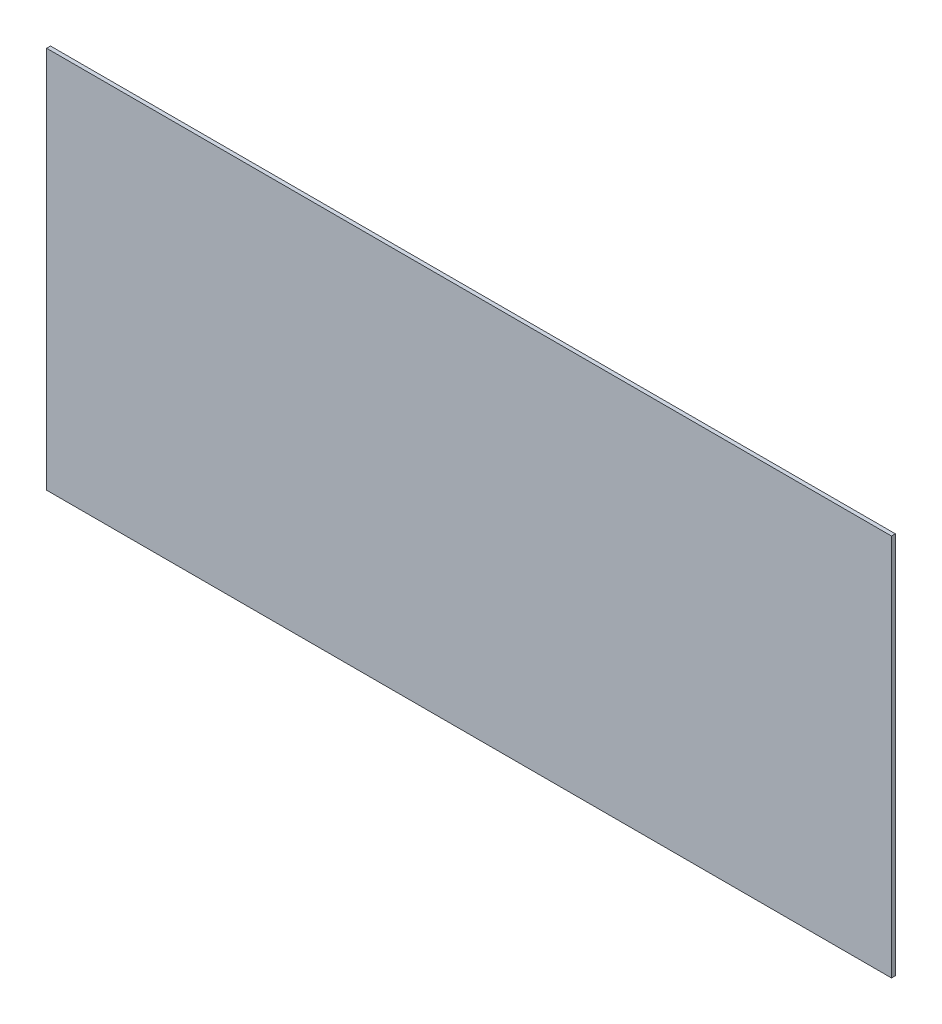
ISO-10303-21;
HEADER;
FILE_DESCRIPTION(('STEP AP214'),'2;1');
FILE_NAME('part.step','',(''),(''),'','','');
FILE_SCHEMA(('AUTOMOTIVE_DESIGN { 1 0 10303 214 1 1 1 1 }'));
ENDSEC;
DATA;
#1=APPLICATION_CONTEXT('core data for automotive mechanical design processes');
#2=APPLICATION_PROTOCOL_DEFINITION('international standard','automotive_design',2000,#1);
#3=PRODUCT_CONTEXT('',#1,'mechanical');
#4=PRODUCT('Part','Part','',(#3));
#5=PRODUCT_RELATED_PRODUCT_CATEGORY('part','',(#4));
#6=PRODUCT_DEFINITION_FORMATION('','',#4);
#7=PRODUCT_DEFINITION_CONTEXT('part definition',#1,'design');
#8=PRODUCT_DEFINITION('design','',#6,#7);
#9=PRODUCT_DEFINITION_SHAPE('','',#8);
#10=(LENGTH_UNIT() NAMED_UNIT(*) SI_UNIT(.MILLI.,.METRE.));
#11=(NAMED_UNIT(*) PLANE_ANGLE_UNIT() SI_UNIT($,.RADIAN.));
#12=(NAMED_UNIT(*) SI_UNIT($,.STERADIAN.) SOLID_ANGLE_UNIT());
#13=UNCERTAINTY_MEASURE_WITH_UNIT(LENGTH_MEASURE(1.E-05),#10,'distance_accuracy_value','');
#14=(GEOMETRIC_REPRESENTATION_CONTEXT(3) GLOBAL_UNCERTAINTY_ASSIGNED_CONTEXT((#13)) GLOBAL_UNIT_ASSIGNED_CONTEXT((#10,
#11,#12)) REPRESENTATION_CONTEXT('',''));
#15=CARTESIAN_POINT('',(0.,0.,0.));
#16=DIRECTION('',(0.,0.,1.));
#17=DIRECTION('',(1.,0.,0.));
#18=AXIS2_PLACEMENT_3D('',#15,#16,#17);
#19=CARTESIAN_POINT('',(0.,0.,1.5875));
#20=DIRECTION('',(1.,0.,0.));
#21=DIRECTION('',(0.,0.,-1.));
#22=AXIS2_PLACEMENT_3D('',#19,#20,#21);
#23=PLANE('',#22);
#24=DIRECTION('',(0.,-1.,0.));
#25=VECTOR('',#24,1.);
#26=CARTESIAN_POINT('',(0.,0.,0.));
#27=LINE('',#26,#25);
#28=CARTESIAN_POINT('',(0.,156.55,0.));
#29=VERTEX_POINT('',#28);
#30=CARTESIAN_POINT('',(0.,0.,0.));
#31=VERTEX_POINT('',#30);
#32=EDGE_CURVE('E111',#29,#31,#27,.T.);
#33=ORIENTED_EDGE('',*,*,#32,.T.);
#34=DIRECTION('',(0.,0.,-1.));
#35=VECTOR('',#34,1.);
#36=CARTESIAN_POINT('',(0.,0.,1.5875));
#37=LINE('',#36,#35);
#38=CARTESIAN_POINT('',(0.,0.,1.5875));
#39=VERTEX_POINT('',#38);
#40=EDGE_CURVE('E11',#39,#31,#37,.T.);
#41=ORIENTED_EDGE('',*,*,#40,.F.);
#42=DIRECTION('',(0.,-1.,0.));
#43=VECTOR('',#42,1.);
#44=CARTESIAN_POINT('',(0.,0.,1.5875));
#45=LINE('',#44,#43);
#46=CARTESIAN_POINT('',(0.,156.55,1.5875));
#47=VERTEX_POINT('',#46);
#48=EDGE_CURVE('E95',#47,#39,#45,.T.);
#49=ORIENTED_EDGE('',*,*,#48,.F.);
#50=DIRECTION('',(0.,0.,-1.));
#51=VECTOR('',#50,1.);
#52=CARTESIAN_POINT('',(0.,156.55,1.5875));
#53=LINE('',#52,#51);
#54=EDGE_CURVE('E107',#47,#29,#53,.T.);
#55=ORIENTED_EDGE('',*,*,#54,.T.);
#56=EDGE_LOOP('',(#33,#41,#49,#55));
#57=FACE_BOUND('',#56,.T.);
#58=ADVANCED_FACE('F43',(#57),#23,.F.);
#59=CARTESIAN_POINT('',(0.,0.,1.5875));
#60=DIRECTION('',(0.,1.,0.));
#61=DIRECTION('',(0.,0.,1.));
#62=AXIS2_PLACEMENT_3D('',#59,#60,#61);
#63=PLANE('',#62);
#64=DIRECTION('',(1.,0.,0.));
#65=VECTOR('',#64,1.);
#66=CARTESIAN_POINT('',(0.,0.,0.));
#67=LINE('',#66,#65);
#68=CARTESIAN_POINT('',(345.57,0.,0.));
#69=VERTEX_POINT('',#68);
#70=EDGE_CURVE('E100',#31,#69,#67,.T.);
#71=ORIENTED_EDGE('',*,*,#70,.T.);
#72=DIRECTION('',(0.,0.,-1.));
#73=VECTOR('',#72,1.);
#74=CARTESIAN_POINT('',(345.57,0.,1.5875));
#75=LINE('',#74,#73);
#76=CARTESIAN_POINT('',(345.57,0.,1.5875));
#77=VERTEX_POINT('',#76);
#78=EDGE_CURVE('E52',#77,#69,#75,.T.);
#79=ORIENTED_EDGE('',*,*,#78,.F.);
#80=DIRECTION('',(1.,0.,0.));
#81=VECTOR('',#80,1.);
#82=CARTESIAN_POINT('',(0.,0.,1.5875));
#83=LINE('',#82,#81);
#84=EDGE_CURVE('E90',#39,#77,#83,.T.);
#85=ORIENTED_EDGE('',*,*,#84,.F.);
#86=ORIENTED_EDGE('',*,*,#40,.T.);
#87=EDGE_LOOP('',(#71,#79,#85,#86));
#88=FACE_BOUND('',#87,.T.);
#89=ADVANCED_FACE('F99',(#88),#63,.F.);
#90=CARTESIAN_POINT('',(345.57,0.,1.5875));
#91=DIRECTION('',(-1.,0.,0.));
#92=DIRECTION('',(0.,0.,1.));
#93=AXIS2_PLACEMENT_3D('',#90,#91,#92);
#94=PLANE('',#93);
#95=DIRECTION('',(0.,1.,0.));
#96=VECTOR('',#95,1.);
#97=CARTESIAN_POINT('',(345.57,0.,0.));
#98=LINE('',#97,#96);
#99=CARTESIAN_POINT('',(345.57,156.55,0.));
#100=VERTEX_POINT('',#99);
#101=EDGE_CURVE('E77',#69,#100,#98,.T.);
#102=ORIENTED_EDGE('',*,*,#101,.T.);
#103=DIRECTION('',(0.,0.,-1.));
#104=VECTOR('',#103,1.);
#105=CARTESIAN_POINT('',(345.57,156.55,1.5875));
#106=LINE('',#105,#104);
#107=CARTESIAN_POINT('',(345.57,156.55,1.5875));
#108=VERTEX_POINT('',#107);
#109=EDGE_CURVE('E102',#108,#100,#106,.T.);
#110=ORIENTED_EDGE('',*,*,#109,.F.);
#111=DIRECTION('',(0.,1.,0.));
#112=VECTOR('',#111,1.);
#113=CARTESIAN_POINT('',(345.57,0.,1.5875));
#114=LINE('',#113,#112);
#115=EDGE_CURVE('E93',#77,#108,#114,.T.);
#116=ORIENTED_EDGE('',*,*,#115,.F.);
#117=ORIENTED_EDGE('',*,*,#78,.T.);
#118=EDGE_LOOP('',(#102,#110,#116,#117));
#119=FACE_BOUND('',#118,.T.);
#120=ADVANCED_FACE('F103',(#119),#94,.F.);
#121=CARTESIAN_POINT('',(0.,156.55,1.5875));
#122=DIRECTION('',(0.,-1.,0.));
#123=DIRECTION('',(0.,0.,-1.));
#124=AXIS2_PLACEMENT_3D('',#121,#122,#123);
#125=PLANE('',#124);
#126=DIRECTION('',(-1.,0.,0.));
#127=VECTOR('',#126,1.);
#128=CARTESIAN_POINT('',(0.,156.55,0.));
#129=LINE('',#128,#127);
#130=EDGE_CURVE('E83',#100,#29,#129,.T.);
#131=ORIENTED_EDGE('',*,*,#130,.T.);
#132=ORIENTED_EDGE('',*,*,#54,.F.);
#133=DIRECTION('',(-1.,0.,0.));
#134=VECTOR('',#133,1.);
#135=CARTESIAN_POINT('',(0.,156.55,1.5875));
#136=LINE('',#135,#134);
#137=EDGE_CURVE('E60',#108,#47,#136,.T.);
#138=ORIENTED_EDGE('',*,*,#137,.F.);
#139=ORIENTED_EDGE('',*,*,#109,.T.);
#140=EDGE_LOOP('',(#131,#132,#138,#139));
#141=FACE_BOUND('',#140,.T.);
#142=ADVANCED_FACE('F124',(#141),#125,.F.);
#143=CARTESIAN_POINT('',(0.,0.,1.5875));
#144=DIRECTION('',(0.,0.,-1.));
#145=DIRECTION('',(-1.,0.,0.));
#146=AXIS2_PLACEMENT_3D('',#143,#144,#145);
#147=PLANE('',#146);
#148=ORIENTED_EDGE('',*,*,#48,.T.);
#149=ORIENTED_EDGE('',*,*,#84,.T.);
#150=ORIENTED_EDGE('',*,*,#115,.T.);
#151=ORIENTED_EDGE('',*,*,#137,.T.);
#152=EDGE_LOOP('',(#148,#149,#150,#151));
#153=FACE_BOUND('',#152,.T.);
#154=ADVANCED_FACE('F91',(#153),#147,.F.);
#155=CARTESIAN_POINT('',(0.,0.,0.));
#156=DIRECTION('',(0.,0.,-1.));
#157=DIRECTION('',(-1.,0.,0.));
#158=AXIS2_PLACEMENT_3D('',#155,#156,#157);
#159=PLANE('',#158);
#160=ORIENTED_EDGE('',*,*,#32,.F.);
#161=ORIENTED_EDGE('',*,*,#130,.F.);
#162=ORIENTED_EDGE('',*,*,#101,.F.);
#163=ORIENTED_EDGE('',*,*,#70,.F.);
#164=EDGE_LOOP('',(#160,#161,#162,#163));
#165=FACE_BOUND('',#164,.T.);
#166=ADVANCED_FACE('F127',(#165),#159,.T.);
#167=CLOSED_SHELL('',(#58,#89,#120,#142,#154,#166));
#168=MANIFOLD_SOLID_BREP('B2',#167);
#169=ADVANCED_BREP_SHAPE_REPRESENTATION('',(#18,#168),#14);
#170=SHAPE_DEFINITION_REPRESENTATION(#9,#169);
ENDSEC;
END-ISO-10303-21;
